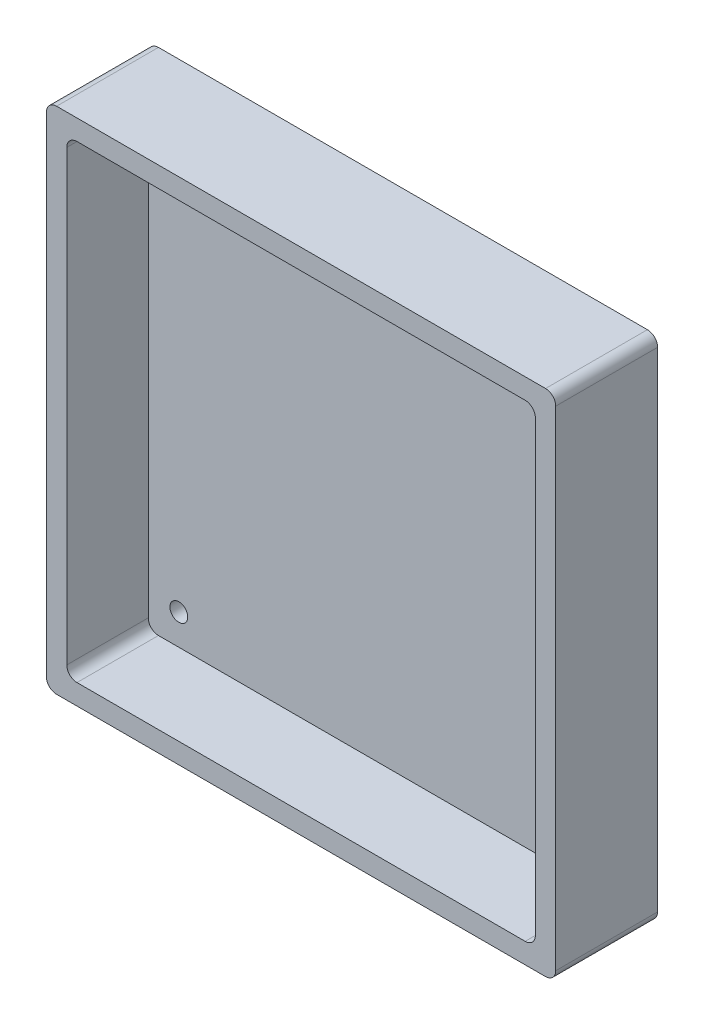
ISO-10303-21;
HEADER;
FILE_DESCRIPTION(('STEP AP214'),'2;1');
FILE_NAME('part.step','',(''),(''),'','','');
FILE_SCHEMA(('AUTOMOTIVE_DESIGN { 1 0 10303 214 1 1 1 1 }'));
ENDSEC;
DATA;
#1=APPLICATION_CONTEXT('core data for automotive mechanical design processes');
#2=APPLICATION_PROTOCOL_DEFINITION('international standard','automotive_design',2000,#1);
#3=PRODUCT_CONTEXT('',#1,'mechanical');
#4=PRODUCT('Part','Part','',(#3));
#5=PRODUCT_RELATED_PRODUCT_CATEGORY('part','',(#4));
#6=PRODUCT_DEFINITION_FORMATION('','',#4);
#7=PRODUCT_DEFINITION_CONTEXT('part definition',#1,'design');
#8=PRODUCT_DEFINITION('design','',#6,#7);
#9=PRODUCT_DEFINITION_SHAPE('','',#8);
#10=(LENGTH_UNIT() NAMED_UNIT(*) SI_UNIT(.MILLI.,.METRE.));
#11=(NAMED_UNIT(*) PLANE_ANGLE_UNIT() SI_UNIT($,.RADIAN.));
#12=(NAMED_UNIT(*) SI_UNIT($,.STERADIAN.) SOLID_ANGLE_UNIT());
#13=UNCERTAINTY_MEASURE_WITH_UNIT(LENGTH_MEASURE(1.E-05),#10,'distance_accuracy_value','');
#14=(GEOMETRIC_REPRESENTATION_CONTEXT(3) GLOBAL_UNCERTAINTY_ASSIGNED_CONTEXT((#13)) GLOBAL_UNIT_ASSIGNED_CONTEXT((#10,
#11,#12)) REPRESENTATION_CONTEXT('',''));
#15=CARTESIAN_POINT('',(0.,0.,0.));
#16=DIRECTION('',(0.,0.,1.));
#17=DIRECTION('',(1.,0.,0.));
#18=AXIS2_PLACEMENT_3D('',#15,#16,#17);
#19=CARTESIAN_POINT('',(-50.,50.,20.));
#20=DIRECTION('',(1.,0.,0.));
#21=DIRECTION('',(0.,1.,0.));
#22=AXIS2_PLACEMENT_3D('',#19,#20,#21);
#23=PLANE('',#22);
#24=DIRECTION('',(0.,-1.,0.));
#25=VECTOR('',#24,1.);
#26=CARTESIAN_POINT('',(-50.,50.,0.));
#27=LINE('',#26,#25);
#28=CARTESIAN_POINT('',(-50.,48.,0.));
#29=VERTEX_POINT('',#28);
#30=CARTESIAN_POINT('',(-50.,-48.,0.));
#31=VERTEX_POINT('',#30);
#32=EDGE_CURVE('E206',#29,#31,#27,.T.);
#33=ORIENTED_EDGE('',*,*,#32,.T.);
#34=DIRECTION('',(0.,0.,-1.));
#35=VECTOR('',#34,1.);
#36=CARTESIAN_POINT('',(-50.,-48.,20.));
#37=LINE('',#36,#35);
#38=CARTESIAN_POINT('',(-50.,-48.,20.));
#39=VERTEX_POINT('',#38);
#40=EDGE_CURVE('E266',#31,#39,#37,.F.);
#41=ORIENTED_EDGE('',*,*,#40,.T.);
#42=DIRECTION('',(0.,-1.,0.));
#43=VECTOR('',#42,1.);
#44=CARTESIAN_POINT('',(-50.,50.,20.));
#45=LINE('',#44,#43);
#46=CARTESIAN_POINT('',(-50.,48.,20.));
#47=VERTEX_POINT('',#46);
#48=EDGE_CURVE('E195',#47,#39,#45,.T.);
#49=ORIENTED_EDGE('',*,*,#48,.F.);
#50=DIRECTION('',(0.,0.,-1.));
#51=VECTOR('',#50,1.);
#52=CARTESIAN_POINT('',(-50.,48.,20.));
#53=LINE('',#52,#51);
#54=EDGE_CURVE('E263',#47,#29,#53,.T.);
#55=ORIENTED_EDGE('',*,*,#54,.T.);
#56=EDGE_LOOP('',(#33,#41,#49,#55));
#57=FACE_BOUND('',#56,.T.);
#58=ADVANCED_FACE('F39',(#57),#23,.F.);
#59=CARTESIAN_POINT('',(50.,-50.,20.));
#60=DIRECTION('',(0.,1.,0.));
#61=DIRECTION('',(-1.,0.,0.));
#62=AXIS2_PLACEMENT_3D('',#59,#60,#61);
#63=PLANE('',#62);
#64=DIRECTION('',(1.,0.,0.));
#65=VECTOR('',#64,1.);
#66=CARTESIAN_POINT('',(50.,-50.,0.));
#67=LINE('',#66,#65);
#68=CARTESIAN_POINT('',(-48.,-50.,0.));
#69=VERTEX_POINT('',#68);
#70=CARTESIAN_POINT('',(48.,-50.,0.));
#71=VERTEX_POINT('',#70);
#72=EDGE_CURVE('E209',#69,#71,#67,.T.);
#73=ORIENTED_EDGE('',*,*,#72,.T.);
#74=DIRECTION('',(0.,0.,-1.));
#75=VECTOR('',#74,1.);
#76=CARTESIAN_POINT('',(48.,-50.,20.));
#77=LINE('',#76,#75);
#78=CARTESIAN_POINT('',(48.,-50.,20.));
#79=VERTEX_POINT('',#78);
#80=EDGE_CURVE('E254',#71,#79,#77,.F.);
#81=ORIENTED_EDGE('',*,*,#80,.T.);
#82=DIRECTION('',(1.,0.,0.));
#83=VECTOR('',#82,1.);
#84=CARTESIAN_POINT('',(50.,-50.,20.));
#85=LINE('',#84,#83);
#86=CARTESIAN_POINT('',(-48.,-50.,20.));
#87=VERTEX_POINT('',#86);
#88=EDGE_CURVE('E198',#87,#79,#85,.T.);
#89=ORIENTED_EDGE('',*,*,#88,.F.);
#90=DIRECTION('',(0.,0.,-1.));
#91=VECTOR('',#90,1.);
#92=CARTESIAN_POINT('',(-48.,-50.,20.));
#93=LINE('',#92,#91);
#94=EDGE_CURVE('E251',#87,#69,#93,.T.);
#95=ORIENTED_EDGE('',*,*,#94,.T.);
#96=EDGE_LOOP('',(#73,#81,#89,#95));
#97=FACE_BOUND('',#96,.T.);
#98=ADVANCED_FACE('F349',(#97),#63,.F.);
#99=CARTESIAN_POINT('',(50.,50.,20.));
#100=DIRECTION('',(-1.,0.,0.));
#101=DIRECTION('',(0.,-1.,0.));
#102=AXIS2_PLACEMENT_3D('',#99,#100,#101);
#103=PLANE('',#102);
#104=DIRECTION('',(0.,1.,0.));
#105=VECTOR('',#104,1.);
#106=CARTESIAN_POINT('',(50.,50.,20.));
#107=LINE('',#106,#105);
#108=CARTESIAN_POINT('',(50.,-48.,20.));
#109=VERTEX_POINT('',#108);
#110=CARTESIAN_POINT('',(50.,48.,20.));
#111=VERTEX_POINT('',#110);
#112=EDGE_CURVE('E202',#109,#111,#107,.T.);
#113=ORIENTED_EDGE('',*,*,#112,.F.);
#114=DIRECTION('',(0.,0.,-1.));
#115=VECTOR('',#114,1.);
#116=CARTESIAN_POINT('',(50.,-48.,20.));
#117=LINE('',#116,#115);
#118=CARTESIAN_POINT('',(50.,-48.,0.));
#119=VERTEX_POINT('',#118);
#120=EDGE_CURVE('E240',#109,#119,#117,.T.);
#121=ORIENTED_EDGE('',*,*,#120,.T.);
#122=DIRECTION('',(0.,1.,0.));
#123=VECTOR('',#122,1.);
#124=CARTESIAN_POINT('',(50.,50.,0.));
#125=LINE('',#124,#123);
#126=CARTESIAN_POINT('',(50.,48.,0.));
#127=VERTEX_POINT('',#126);
#128=EDGE_CURVE('E212',#119,#127,#125,.T.);
#129=ORIENTED_EDGE('',*,*,#128,.T.);
#130=DIRECTION('',(0.,0.,-1.));
#131=VECTOR('',#130,1.);
#132=CARTESIAN_POINT('',(50.,48.,20.));
#133=LINE('',#132,#131);
#134=EDGE_CURVE('E238',#127,#111,#133,.F.);
#135=ORIENTED_EDGE('',*,*,#134,.T.);
#136=EDGE_LOOP('',(#113,#121,#129,#135));
#137=FACE_BOUND('',#136,.T.);
#138=ADVANCED_FACE('F355',(#137),#103,.F.);
#139=CARTESIAN_POINT('',(50.,50.,20.));
#140=DIRECTION('',(0.,-1.,0.));
#141=DIRECTION('',(1.,0.,0.));
#142=AXIS2_PLACEMENT_3D('',#139,#140,#141);
#143=PLANE('',#142);
#144=DIRECTION('',(-1.,0.,0.));
#145=VECTOR('',#144,1.);
#146=CARTESIAN_POINT('',(50.,50.,0.));
#147=LINE('',#146,#145);
#148=CARTESIAN_POINT('',(48.,50.,0.));
#149=VERTEX_POINT('',#148);
#150=CARTESIAN_POINT('',(-48.,50.,0.));
#151=VERTEX_POINT('',#150);
#152=EDGE_CURVE('E199',#149,#151,#147,.T.);
#153=ORIENTED_EDGE('',*,*,#152,.T.);
#154=DIRECTION('',(0.,0.,-1.));
#155=VECTOR('',#154,1.);
#156=CARTESIAN_POINT('',(-48.,50.,20.));
#157=LINE('',#156,#155);
#158=CARTESIAN_POINT('',(-48.,50.,20.));
#159=VERTEX_POINT('',#158);
#160=EDGE_CURVE('E56',#151,#159,#157,.F.);
#161=ORIENTED_EDGE('',*,*,#160,.T.);
#162=DIRECTION('',(-1.,0.,0.));
#163=VECTOR('',#162,1.);
#164=CARTESIAN_POINT('',(50.,50.,20.));
#165=LINE('',#164,#163);
#166=CARTESIAN_POINT('',(48.,50.,20.));
#167=VERTEX_POINT('',#166);
#168=EDGE_CURVE('E204',#167,#159,#165,.T.);
#169=ORIENTED_EDGE('',*,*,#168,.F.);
#170=DIRECTION('',(0.,0.,-1.));
#171=VECTOR('',#170,1.);
#172=CARTESIAN_POINT('',(48.,50.,20.));
#173=LINE('',#172,#171);
#174=EDGE_CURVE('E268',#167,#149,#173,.T.);
#175=ORIENTED_EDGE('',*,*,#174,.T.);
#176=EDGE_LOOP('',(#153,#161,#169,#175));
#177=FACE_BOUND('',#176,.T.);
#178=ADVANCED_FACE('F534',(#177),#143,.F.);
#179=CARTESIAN_POINT('',(0.,0.,20.));
#180=DIRECTION('',(0.,0.,-1.));
#181=DIRECTION('',(-1.,0.,0.));
#182=AXIS2_PLACEMENT_3D('',#179,#180,#181);
#183=PLANE('',#182);
#184=DIRECTION('',(1.,0.,0.));
#185=VECTOR('',#184,1.);
#186=CARTESIAN_POINT('',(46.,-46.,20.));
#187=LINE('',#186,#185);
#188=CARTESIAN_POINT('',(-44.,-46.,20.));
#189=VERTEX_POINT('',#188);
#190=CARTESIAN_POINT('',(44.,-46.,20.));
#191=VERTEX_POINT('',#190);
#192=EDGE_CURVE('E180',#189,#191,#187,.T.);
#193=ORIENTED_EDGE('',*,*,#192,.F.);
#194=CARTESIAN_POINT('',(-44.,-44.,20.));
#195=DIRECTION('',(0.,0.,-1.));
#196=DIRECTION('',(-1.,0.,0.));
#197=AXIS2_PLACEMENT_3D('',#194,#195,#196);
#198=CIRCLE('',#197,2.);
#199=CARTESIAN_POINT('',(-46.,-44.,20.));
#200=VERTEX_POINT('',#199);
#201=EDGE_CURVE('E11',#189,#200,#198,.T.);
#202=ORIENTED_EDGE('',*,*,#201,.T.);
#203=DIRECTION('',(0.,-1.,0.));
#204=VECTOR('',#203,1.);
#205=CARTESIAN_POINT('',(-46.,-46.,20.));
#206=LINE('',#205,#204);
#207=CARTESIAN_POINT('',(-46.,44.,20.));
#208=VERTEX_POINT('',#207);
#209=EDGE_CURVE('E171',#208,#200,#206,.T.);
#210=ORIENTED_EDGE('',*,*,#209,.F.);
#211=CARTESIAN_POINT('',(-44.,44.,20.));
#212=DIRECTION('',(0.,0.,-1.));
#213=DIRECTION('',(-1.,0.,0.));
#214=AXIS2_PLACEMENT_3D('',#211,#212,#213);
#215=CIRCLE('',#214,2.);
#216=CARTESIAN_POINT('',(-44.,46.,20.));
#217=VERTEX_POINT('',#216);
#218=EDGE_CURVE('E155',#208,#217,#215,.T.);
#219=ORIENTED_EDGE('',*,*,#218,.T.);
#220=DIRECTION('',(-1.,0.,0.));
#221=VECTOR('',#220,1.);
#222=CARTESIAN_POINT('',(46.,46.,20.));
#223=LINE('',#222,#221);
#224=CARTESIAN_POINT('',(44.,46.,20.));
#225=VERTEX_POINT('',#224);
#226=EDGE_CURVE('E193',#225,#217,#223,.T.);
#227=ORIENTED_EDGE('',*,*,#226,.F.);
#228=CARTESIAN_POINT('',(44.,44.,20.));
#229=DIRECTION('',(0.,0.,-1.));
#230=DIRECTION('',(-1.,0.,0.));
#231=AXIS2_PLACEMENT_3D('',#228,#229,#230);
#232=CIRCLE('',#231,2.);
#233=CARTESIAN_POINT('',(46.,44.,20.));
#234=VERTEX_POINT('',#233);
#235=EDGE_CURVE('E165',#225,#234,#232,.T.);
#236=ORIENTED_EDGE('',*,*,#235,.T.);
#237=DIRECTION('',(0.,1.,0.));
#238=VECTOR('',#237,1.);
#239=CARTESIAN_POINT('',(46.,-46.,20.));
#240=LINE('',#239,#238);
#241=CARTESIAN_POINT('',(46.,-44.,20.));
#242=VERTEX_POINT('',#241);
#243=EDGE_CURVE('E183',#242,#234,#240,.T.);
#244=ORIENTED_EDGE('',*,*,#243,.F.);
#245=CARTESIAN_POINT('',(44.,-44.,20.));
#246=DIRECTION('',(0.,0.,-1.));
#247=DIRECTION('',(-1.,0.,0.));
#248=AXIS2_PLACEMENT_3D('',#245,#246,#247);
#249=CIRCLE('',#248,2.);
#250=EDGE_CURVE('E48',#242,#191,#249,.T.);
#251=ORIENTED_EDGE('',*,*,#250,.T.);
#252=EDGE_LOOP('',(#193,#202,#210,#219,#227,#236,#244,#251));
#253=FACE_BOUND('',#252,.T.);
#254=ORIENTED_EDGE('',*,*,#88,.T.);
#255=CARTESIAN_POINT('',(48.,-48.,20.));
#256=DIRECTION('',(0.,0.,-1.));
#257=DIRECTION('',(-1.,0.,0.));
#258=AXIS2_PLACEMENT_3D('',#255,#256,#257);
#259=CIRCLE('',#258,2.);
#260=EDGE_CURVE('E261',#79,#109,#259,.F.);
#261=ORIENTED_EDGE('',*,*,#260,.T.);
#262=ORIENTED_EDGE('',*,*,#112,.T.);
#263=CARTESIAN_POINT('',(48.,48.,20.));
#264=DIRECTION('',(0.,0.,-1.));
#265=DIRECTION('',(-1.,0.,0.));
#266=AXIS2_PLACEMENT_3D('',#263,#264,#265);
#267=CIRCLE('',#266,2.);
#268=EDGE_CURVE('E63',#111,#167,#267,.F.);
#269=ORIENTED_EDGE('',*,*,#268,.T.);
#270=ORIENTED_EDGE('',*,*,#168,.T.);
#271=CARTESIAN_POINT('',(-48.,48.,20.));
#272=DIRECTION('',(0.,0.,-1.));
#273=DIRECTION('',(-1.,0.,0.));
#274=AXIS2_PLACEMENT_3D('',#271,#272,#273);
#275=CIRCLE('',#274,2.);
#276=EDGE_CURVE('E257',#159,#47,#275,.F.);
#277=ORIENTED_EDGE('',*,*,#276,.T.);
#278=ORIENTED_EDGE('',*,*,#48,.T.);
#279=CARTESIAN_POINT('',(-48.,-48.,20.));
#280=DIRECTION('',(0.,0.,-1.));
#281=DIRECTION('',(-1.,0.,0.));
#282=AXIS2_PLACEMENT_3D('',#279,#280,#281);
#283=CIRCLE('',#282,2.);
#284=EDGE_CURVE('E259',#39,#87,#283,.F.);
#285=ORIENTED_EDGE('',*,*,#284,.T.);
#286=EDGE_LOOP('',(#254,#261,#262,#269,#270,#277,#278,#285));
#287=FACE_BOUND('',#286,.T.);
#288=ADVANCED_FACE('F179',(#253,#287),#183,.F.);
#289=CARTESIAN_POINT('',(0.,0.,0.));
#290=DIRECTION('',(0.,0.,-1.));
#291=DIRECTION('',(-1.,0.,0.));
#292=AXIS2_PLACEMENT_3D('',#289,#290,#291);
#293=PLANE('',#292);
#294=CARTESIAN_POINT('',(-39.9999999999977,-40.,0.));
#295=DIRECTION('',(0.,0.,1.));
#296=DIRECTION('',(1.,0.,0.));
#297=AXIS2_PLACEMENT_3D('',#294,#295,#296);
#298=CIRCLE('',#297,1.75);
#299=CARTESIAN_POINT('',(-38.2499999999977,-40.,0.));
#300=VERTEX_POINT('',#299);
#301=EDGE_CURVE('E297',#300,#300,#298,.T.);
#302=ORIENTED_EDGE('',*,*,#301,.T.);
#303=EDGE_LOOP('',(#302));
#304=FACE_BOUND('',#303,.T.);
#305=CARTESIAN_POINT('',(40.0000000000023,-39.9999999999978,0.));
#306=DIRECTION('',(0.,0.,1.));
#307=DIRECTION('',(1.,0.,0.));
#308=AXIS2_PLACEMENT_3D('',#305,#306,#307);
#309=CIRCLE('',#308,1.75);
#310=CARTESIAN_POINT('',(41.7500000000023,-39.9999999999978,0.));
#311=VERTEX_POINT('',#310);
#312=EDGE_CURVE('E294',#311,#311,#309,.T.);
#313=ORIENTED_EDGE('',*,*,#312,.T.);
#314=EDGE_LOOP('',(#313));
#315=FACE_BOUND('',#314,.T.);
#316=CARTESIAN_POINT('',(40.,40.0000000000023,0.));
#317=DIRECTION('',(0.,0.,1.));
#318=DIRECTION('',(1.,0.,0.));
#319=AXIS2_PLACEMENT_3D('',#316,#317,#318);
#320=CIRCLE('',#319,1.75);
#321=CARTESIAN_POINT('',(41.75,40.0000000000023,0.));
#322=VERTEX_POINT('',#321);
#323=EDGE_CURVE('E296',#322,#322,#320,.T.);
#324=ORIENTED_EDGE('',*,*,#323,.T.);
#325=EDGE_LOOP('',(#324));
#326=FACE_BOUND('',#325,.T.);
#327=CARTESIAN_POINT('',(-40.,40.,0.));
#328=DIRECTION('',(0.,0.,1.));
#329=DIRECTION('',(1.,0.,0.));
#330=AXIS2_PLACEMENT_3D('',#327,#328,#329);
#331=CIRCLE('',#330,1.75);
#332=CARTESIAN_POINT('',(-38.25,40.,0.));
#333=VERTEX_POINT('',#332);
#334=EDGE_CURVE('E278',#333,#333,#331,.T.);
#335=ORIENTED_EDGE('',*,*,#334,.T.);
#336=EDGE_LOOP('',(#335));
#337=FACE_BOUND('',#336,.T.);
#338=ORIENTED_EDGE('',*,*,#128,.F.);
#339=CARTESIAN_POINT('',(48.,-48.,0.));
#340=DIRECTION('',(0.,0.,-1.));
#341=DIRECTION('',(-1.,0.,0.));
#342=AXIS2_PLACEMENT_3D('',#339,#340,#341);
#343=CIRCLE('',#342,2.);
#344=EDGE_CURVE('E249',#119,#71,#343,.T.);
#345=ORIENTED_EDGE('',*,*,#344,.T.);
#346=ORIENTED_EDGE('',*,*,#72,.F.);
#347=CARTESIAN_POINT('',(-48.,-48.,0.));
#348=DIRECTION('',(0.,0.,-1.));
#349=DIRECTION('',(-1.,0.,0.));
#350=AXIS2_PLACEMENT_3D('',#347,#348,#349);
#351=CIRCLE('',#350,2.);
#352=EDGE_CURVE('E247',#69,#31,#351,.T.);
#353=ORIENTED_EDGE('',*,*,#352,.T.);
#354=ORIENTED_EDGE('',*,*,#32,.F.);
#355=CARTESIAN_POINT('',(-48.,48.,0.));
#356=DIRECTION('',(0.,0.,-1.));
#357=DIRECTION('',(-1.,0.,0.));
#358=AXIS2_PLACEMENT_3D('',#355,#356,#357);
#359=CIRCLE('',#358,2.);
#360=EDGE_CURVE('E245',#29,#151,#359,.T.);
#361=ORIENTED_EDGE('',*,*,#360,.T.);
#362=ORIENTED_EDGE('',*,*,#152,.F.);
#363=CARTESIAN_POINT('',(48.,48.,0.));
#364=DIRECTION('',(0.,0.,-1.));
#365=DIRECTION('',(-1.,0.,0.));
#366=AXIS2_PLACEMENT_3D('',#363,#364,#365);
#367=CIRCLE('',#366,2.);
#368=EDGE_CURVE('E243',#149,#127,#367,.T.);
#369=ORIENTED_EDGE('',*,*,#368,.T.);
#370=EDGE_LOOP('',(#338,#345,#346,#353,#354,#361,#362,#369));
#371=FACE_BOUND('',#370,.T.);
#372=ADVANCED_FACE('F422',(#304,#315,#326,#337,#371),#293,.T.);
#373=CARTESIAN_POINT('',(-46.,-46.,4.));
#374=DIRECTION('',(-1.,0.,0.));
#375=DIRECTION('',(0.,0.,1.));
#376=AXIS2_PLACEMENT_3D('',#373,#374,#375);
#377=PLANE('',#376);
#378=DIRECTION('',(0.,-1.,0.));
#379=VECTOR('',#378,1.);
#380=CARTESIAN_POINT('',(-46.,-46.,4.));
#381=LINE('',#380,#379);
#382=CARTESIAN_POINT('',(-46.,44.,4.));
#383=VERTEX_POINT('',#382);
#384=CARTESIAN_POINT('',(-46.,-44.,4.));
#385=VERTEX_POINT('',#384);
#386=EDGE_CURVE('E174',#383,#385,#381,.T.);
#387=ORIENTED_EDGE('',*,*,#386,.F.);
#388=DIRECTION('',(0.,0.,1.));
#389=VECTOR('',#388,1.);
#390=CARTESIAN_POINT('',(-46.,44.,20.));
#391=LINE('',#390,#389);
#392=EDGE_CURVE('E159',#383,#208,#391,.T.);
#393=ORIENTED_EDGE('',*,*,#392,.T.);
#394=ORIENTED_EDGE('',*,*,#209,.T.);
#395=DIRECTION('',(0.,0.,1.));
#396=VECTOR('',#395,1.);
#397=CARTESIAN_POINT('',(-46.,-44.,4.));
#398=LINE('',#397,#396);
#399=EDGE_CURVE('E176',#200,#385,#398,.F.);
#400=ORIENTED_EDGE('',*,*,#399,.T.);
#401=EDGE_LOOP('',(#387,#393,#394,#400));
#402=FACE_BOUND('',#401,.T.);
#403=ADVANCED_FACE('F170',(#402),#377,.F.);
#404=CARTESIAN_POINT('',(46.,46.,4.));
#405=DIRECTION('',(0.,1.,0.));
#406=DIRECTION('',(-1.,0.,0.));
#407=AXIS2_PLACEMENT_3D('',#404,#405,#406);
#408=PLANE('',#407);
#409=ORIENTED_EDGE('',*,*,#226,.T.);
#410=DIRECTION('',(0.,0.,1.));
#411=VECTOR('',#410,1.);
#412=CARTESIAN_POINT('',(-44.,46.,4.));
#413=LINE('',#412,#411);
#414=CARTESIAN_POINT('',(-44.,46.,4.));
#415=VERTEX_POINT('',#414);
#416=EDGE_CURVE('E160',#217,#415,#413,.F.);
#417=ORIENTED_EDGE('',*,*,#416,.T.);
#418=DIRECTION('',(-1.,0.,0.));
#419=VECTOR('',#418,1.);
#420=CARTESIAN_POINT('',(46.,46.,4.));
#421=LINE('',#420,#419);
#422=CARTESIAN_POINT('',(44.,46.,4.));
#423=VERTEX_POINT('',#422);
#424=EDGE_CURVE('E188',#423,#415,#421,.T.);
#425=ORIENTED_EDGE('',*,*,#424,.F.);
#426=DIRECTION('',(0.,0.,1.));
#427=VECTOR('',#426,1.);
#428=CARTESIAN_POINT('',(44.,46.,20.));
#429=LINE('',#428,#427);
#430=EDGE_CURVE('E175',#423,#225,#429,.T.);
#431=ORIENTED_EDGE('',*,*,#430,.T.);
#432=EDGE_LOOP('',(#409,#417,#425,#431));
#433=FACE_BOUND('',#432,.T.);
#434=ADVANCED_FACE('F318',(#433),#408,.F.);
#435=CARTESIAN_POINT('',(46.,-46.,4.));
#436=DIRECTION('',(1.,0.,0.));
#437=DIRECTION('',(0.,0.,-1.));
#438=AXIS2_PLACEMENT_3D('',#435,#436,#437);
#439=PLANE('',#438);
#440=ORIENTED_EDGE('',*,*,#243,.T.);
#441=DIRECTION('',(0.,0.,1.));
#442=VECTOR('',#441,1.);
#443=CARTESIAN_POINT('',(46.,44.,4.));
#444=LINE('',#443,#442);
#445=CARTESIAN_POINT('',(46.,44.,4.));
#446=VERTEX_POINT('',#445);
#447=EDGE_CURVE('E231',#234,#446,#444,.F.);
#448=ORIENTED_EDGE('',*,*,#447,.T.);
#449=DIRECTION('',(0.,1.,0.));
#450=VECTOR('',#449,1.);
#451=CARTESIAN_POINT('',(46.,-46.,4.));
#452=LINE('',#451,#450);
#453=CARTESIAN_POINT('',(46.,-44.,4.));
#454=VERTEX_POINT('',#453);
#455=EDGE_CURVE('E309',#454,#446,#452,.T.);
#456=ORIENTED_EDGE('',*,*,#455,.F.);
#457=DIRECTION('',(0.,0.,1.));
#458=VECTOR('',#457,1.);
#459=CARTESIAN_POINT('',(46.,-44.,20.));
#460=LINE('',#459,#458);
#461=EDGE_CURVE('E228',#454,#242,#460,.T.);
#462=ORIENTED_EDGE('',*,*,#461,.T.);
#463=EDGE_LOOP('',(#440,#448,#456,#462));
#464=FACE_BOUND('',#463,.T.);
#465=ADVANCED_FACE('F324',(#464),#439,.F.);
#466=CARTESIAN_POINT('',(46.,-46.,4.));
#467=DIRECTION('',(0.,-1.,0.));
#468=DIRECTION('',(1.,0.,0.));
#469=AXIS2_PLACEMENT_3D('',#466,#467,#468);
#470=PLANE('',#469);
#471=ORIENTED_EDGE('',*,*,#192,.T.);
#472=DIRECTION('',(0.,0.,1.));
#473=VECTOR('',#472,1.);
#474=CARTESIAN_POINT('',(44.,-46.,4.));
#475=LINE('',#474,#473);
#476=CARTESIAN_POINT('',(44.,-46.,4.));
#477=VERTEX_POINT('',#476);
#478=EDGE_CURVE('E236',#191,#477,#475,.F.);
#479=ORIENTED_EDGE('',*,*,#478,.T.);
#480=DIRECTION('',(1.,0.,0.));
#481=VECTOR('',#480,1.);
#482=CARTESIAN_POINT('',(46.,-46.,4.));
#483=LINE('',#482,#481);
#484=CARTESIAN_POINT('',(-44.,-46.,4.));
#485=VERTEX_POINT('',#484);
#486=EDGE_CURVE('E307',#485,#477,#483,.T.);
#487=ORIENTED_EDGE('',*,*,#486,.F.);
#488=DIRECTION('',(0.,0.,1.));
#489=VECTOR('',#488,1.);
#490=CARTESIAN_POINT('',(-44.,-46.,20.));
#491=LINE('',#490,#489);
#492=EDGE_CURVE('E233',#485,#189,#491,.T.);
#493=ORIENTED_EDGE('',*,*,#492,.T.);
#494=EDGE_LOOP('',(#471,#479,#487,#493));
#495=FACE_BOUND('',#494,.T.);
#496=ADVANCED_FACE('F331',(#495),#470,.F.);
#497=CARTESIAN_POINT('',(0.,0.,4.));
#498=DIRECTION('',(0.,0.,1.));
#499=DIRECTION('',(1.,0.,0.));
#500=AXIS2_PLACEMENT_3D('',#497,#498,#499);
#501=PLANE('',#500);
#502=CARTESIAN_POINT('',(-39.9999999999977,-40.,4.));
#503=DIRECTION('',(0.,0.,1.));
#504=DIRECTION('',(1.,0.,0.));
#505=AXIS2_PLACEMENT_3D('',#502,#503,#504);
#506=CIRCLE('',#505,1.75);
#507=CARTESIAN_POINT('',(-38.2499999999977,-40.,4.));
#508=VERTEX_POINT('',#507);
#509=EDGE_CURVE('E43',#508,#508,#506,.F.);
#510=ORIENTED_EDGE('',*,*,#509,.T.);
#511=EDGE_LOOP('',(#510));
#512=FACE_BOUND('',#511,.T.);
#513=CARTESIAN_POINT('',(40.0000000000023,-39.9999999999978,4.));
#514=DIRECTION('',(0.,0.,1.));
#515=DIRECTION('',(1.,0.,0.));
#516=AXIS2_PLACEMENT_3D('',#513,#514,#515);
#517=CIRCLE('',#516,1.75);
#518=CARTESIAN_POINT('',(41.7500000000023,-39.9999999999978,4.));
#519=VERTEX_POINT('',#518);
#520=EDGE_CURVE('E186',#519,#519,#517,.F.);
#521=ORIENTED_EDGE('',*,*,#520,.T.);
#522=EDGE_LOOP('',(#521));
#523=FACE_BOUND('',#522,.T.);
#524=CARTESIAN_POINT('',(40.,40.0000000000023,4.));
#525=DIRECTION('',(0.,0.,1.));
#526=DIRECTION('',(1.,0.,0.));
#527=AXIS2_PLACEMENT_3D('',#524,#525,#526);
#528=CIRCLE('',#527,1.75);
#529=CARTESIAN_POINT('',(41.75,40.0000000000023,4.));
#530=VERTEX_POINT('',#529);
#531=EDGE_CURVE('E277',#530,#530,#528,.F.);
#532=ORIENTED_EDGE('',*,*,#531,.T.);
#533=EDGE_LOOP('',(#532));
#534=FACE_BOUND('',#533,.T.);
#535=CARTESIAN_POINT('',(-40.,40.,4.));
#536=DIRECTION('',(0.,0.,1.));
#537=DIRECTION('',(1.,0.,0.));
#538=AXIS2_PLACEMENT_3D('',#535,#536,#537);
#539=CIRCLE('',#538,1.75);
#540=CARTESIAN_POINT('',(-38.25,40.,4.));
#541=VERTEX_POINT('',#540);
#542=EDGE_CURVE('E274',#541,#541,#539,.F.);
#543=ORIENTED_EDGE('',*,*,#542,.T.);
#544=EDGE_LOOP('',(#543));
#545=FACE_BOUND('',#544,.T.);
#546=ORIENTED_EDGE('',*,*,#424,.T.);
#547=CARTESIAN_POINT('',(-44.,44.,4.));
#548=DIRECTION('',(0.,0.,1.));
#549=DIRECTION('',(1.,0.,0.));
#550=AXIS2_PLACEMENT_3D('',#547,#548,#549);
#551=CIRCLE('',#550,2.);
#552=EDGE_CURVE('E226',#415,#383,#551,.T.);
#553=ORIENTED_EDGE('',*,*,#552,.T.);
#554=ORIENTED_EDGE('',*,*,#386,.T.);
#555=CARTESIAN_POINT('',(-44.,-44.,4.));
#556=DIRECTION('',(0.,0.,1.));
#557=DIRECTION('',(1.,0.,0.));
#558=AXIS2_PLACEMENT_3D('',#555,#556,#557);
#559=CIRCLE('',#558,2.);
#560=EDGE_CURVE('E220',#385,#485,#559,.T.);
#561=ORIENTED_EDGE('',*,*,#560,.T.);
#562=ORIENTED_EDGE('',*,*,#486,.T.);
#563=CARTESIAN_POINT('',(44.,-44.,4.));
#564=DIRECTION('',(0.,0.,1.));
#565=DIRECTION('',(1.,0.,0.));
#566=AXIS2_PLACEMENT_3D('',#563,#564,#565);
#567=CIRCLE('',#566,2.);
#568=EDGE_CURVE('E222',#477,#454,#567,.T.);
#569=ORIENTED_EDGE('',*,*,#568,.T.);
#570=ORIENTED_EDGE('',*,*,#455,.T.);
#571=CARTESIAN_POINT('',(44.,44.,4.));
#572=DIRECTION('',(0.,0.,1.));
#573=DIRECTION('',(1.,0.,0.));
#574=AXIS2_PLACEMENT_3D('',#571,#572,#573);
#575=CIRCLE('',#574,2.);
#576=EDGE_CURVE('E224',#446,#423,#575,.T.);
#577=ORIENTED_EDGE('',*,*,#576,.T.);
#578=EDGE_LOOP('',(#546,#553,#554,#561,#562,#569,#570,#577));
#579=FACE_BOUND('',#578,.T.);
#580=ADVANCED_FACE('F283',(#512,#523,#534,#545,#579),#501,.T.);
#581=CARTESIAN_POINT('',(-44.,44.,4.));
#582=DIRECTION('',(0.,0.,-1.));
#583=DIRECTION('',(-1.,0.,0.));
#584=AXIS2_PLACEMENT_3D('',#581,#582,#583);
#585=CYLINDRICAL_SURFACE('',#584,2.);
#586=ORIENTED_EDGE('',*,*,#552,.F.);
#587=ORIENTED_EDGE('',*,*,#416,.F.);
#588=ORIENTED_EDGE('',*,*,#218,.F.);
#589=ORIENTED_EDGE('',*,*,#392,.F.);
#590=EDGE_LOOP('',(#586,#587,#588,#589));
#591=FACE_BOUND('',#590,.T.);
#592=ADVANCED_FACE('F158',(#591),#585,.F.);
#593=CARTESIAN_POINT('',(44.,44.,4.));
#594=DIRECTION('',(0.,0.,-1.));
#595=DIRECTION('',(-1.,0.,0.));
#596=AXIS2_PLACEMENT_3D('',#593,#594,#595);
#597=CYLINDRICAL_SURFACE('',#596,2.);
#598=ORIENTED_EDGE('',*,*,#576,.F.);
#599=ORIENTED_EDGE('',*,*,#447,.F.);
#600=ORIENTED_EDGE('',*,*,#235,.F.);
#601=ORIENTED_EDGE('',*,*,#430,.F.);
#602=EDGE_LOOP('',(#598,#599,#600,#601));
#603=FACE_BOUND('',#602,.T.);
#604=ADVANCED_FACE('F320',(#603),#597,.F.);
#605=CARTESIAN_POINT('',(44.,-44.,4.));
#606=DIRECTION('',(0.,0.,-1.));
#607=DIRECTION('',(-1.,0.,0.));
#608=AXIS2_PLACEMENT_3D('',#605,#606,#607);
#609=CYLINDRICAL_SURFACE('',#608,2.);
#610=ORIENTED_EDGE('',*,*,#568,.F.);
#611=ORIENTED_EDGE('',*,*,#478,.F.);
#612=ORIENTED_EDGE('',*,*,#250,.F.);
#613=ORIENTED_EDGE('',*,*,#461,.F.);
#614=EDGE_LOOP('',(#610,#611,#612,#613));
#615=FACE_BOUND('',#614,.T.);
#616=ADVANCED_FACE('F328',(#615),#609,.F.);
#617=CARTESIAN_POINT('',(-44.,-44.,4.));
#618=DIRECTION('',(0.,0.,-1.));
#619=DIRECTION('',(-1.,0.,0.));
#620=AXIS2_PLACEMENT_3D('',#617,#618,#619);
#621=CYLINDRICAL_SURFACE('',#620,2.);
#622=ORIENTED_EDGE('',*,*,#560,.F.);
#623=ORIENTED_EDGE('',*,*,#399,.F.);
#624=ORIENTED_EDGE('',*,*,#201,.F.);
#625=ORIENTED_EDGE('',*,*,#492,.F.);
#626=EDGE_LOOP('',(#622,#623,#624,#625));
#627=FACE_BOUND('',#626,.T.);
#628=ADVANCED_FACE('F336',(#627),#621,.F.);
#629=CARTESIAN_POINT('',(48.,-48.,20.));
#630=DIRECTION('',(0.,0.,-1.));
#631=DIRECTION('',(-1.,0.,0.));
#632=AXIS2_PLACEMENT_3D('',#629,#630,#631);
#633=CYLINDRICAL_SURFACE('',#632,2.);
#634=ORIENTED_EDGE('',*,*,#260,.F.);
#635=ORIENTED_EDGE('',*,*,#80,.F.);
#636=ORIENTED_EDGE('',*,*,#344,.F.);
#637=ORIENTED_EDGE('',*,*,#120,.F.);
#638=EDGE_LOOP('',(#634,#635,#636,#637));
#639=FACE_BOUND('',#638,.T.);
#640=ADVANCED_FACE('F338',(#639),#633,.T.);
#641=CARTESIAN_POINT('',(-48.,-48.,20.));
#642=DIRECTION('',(0.,0.,-1.));
#643=DIRECTION('',(-1.,0.,0.));
#644=AXIS2_PLACEMENT_3D('',#641,#642,#643);
#645=CYLINDRICAL_SURFACE('',#644,2.);
#646=ORIENTED_EDGE('',*,*,#284,.F.);
#647=ORIENTED_EDGE('',*,*,#40,.F.);
#648=ORIENTED_EDGE('',*,*,#352,.F.);
#649=ORIENTED_EDGE('',*,*,#94,.F.);
#650=EDGE_LOOP('',(#646,#647,#648,#649));
#651=FACE_BOUND('',#650,.T.);
#652=ADVANCED_FACE('F344',(#651),#645,.T.);
#653=CARTESIAN_POINT('',(-48.,48.,20.));
#654=DIRECTION('',(0.,0.,-1.));
#655=DIRECTION('',(-1.,0.,0.));
#656=AXIS2_PLACEMENT_3D('',#653,#654,#655);
#657=CYLINDRICAL_SURFACE('',#656,2.);
#658=ORIENTED_EDGE('',*,*,#276,.F.);
#659=ORIENTED_EDGE('',*,*,#160,.F.);
#660=ORIENTED_EDGE('',*,*,#360,.F.);
#661=ORIENTED_EDGE('',*,*,#54,.F.);
#662=EDGE_LOOP('',(#658,#659,#660,#661));
#663=FACE_BOUND('',#662,.T.);
#664=ADVANCED_FACE('F394',(#663),#657,.T.);
#665=CARTESIAN_POINT('',(48.,48.,20.));
#666=DIRECTION('',(0.,0.,-1.));
#667=DIRECTION('',(-1.,0.,0.));
#668=AXIS2_PLACEMENT_3D('',#665,#666,#667);
#669=CYLINDRICAL_SURFACE('',#668,2.);
#670=ORIENTED_EDGE('',*,*,#268,.F.);
#671=ORIENTED_EDGE('',*,*,#134,.F.);
#672=ORIENTED_EDGE('',*,*,#368,.F.);
#673=ORIENTED_EDGE('',*,*,#174,.F.);
#674=EDGE_LOOP('',(#670,#671,#672,#673));
#675=FACE_BOUND('',#674,.T.);
#676=ADVANCED_FACE('F41',(#675),#669,.T.);
#677=CARTESIAN_POINT('',(-40.,40.,16.));
#678=DIRECTION('',(0.,0.,-1.));
#679=DIRECTION('',(-1.,0.,0.));
#680=AXIS2_PLACEMENT_3D('',#677,#678,#679);
#681=CYLINDRICAL_SURFACE('',#680,1.75);
#682=ORIENTED_EDGE('',*,*,#542,.F.);
#683=EDGE_LOOP('',(#682));
#684=FACE_BOUND('',#683,.T.);
#685=ORIENTED_EDGE('',*,*,#334,.F.);
#686=EDGE_LOOP('',(#685));
#687=FACE_BOUND('',#686,.T.);
#688=ADVANCED_FACE('F414',(#684,#687),#681,.F.);
#689=CARTESIAN_POINT('',(40.,40.0000000000023,16.));
#690=DIRECTION('',(0.,0.,-1.));
#691=DIRECTION('',(-1.,0.,0.));
#692=AXIS2_PLACEMENT_3D('',#689,#690,#691);
#693=CYLINDRICAL_SURFACE('',#692,1.75);
#694=ORIENTED_EDGE('',*,*,#531,.F.);
#695=EDGE_LOOP('',(#694));
#696=FACE_BOUND('',#695,.T.);
#697=ORIENTED_EDGE('',*,*,#323,.F.);
#698=EDGE_LOOP('',(#697));
#699=FACE_BOUND('',#698,.T.);
#700=ADVANCED_FACE('F290',(#696,#699),#693,.F.);
#701=CARTESIAN_POINT('',(40.0000000000023,-39.9999999999978,16.));
#702=DIRECTION('',(0.,0.,-1.));
#703=DIRECTION('',(-1.,0.,0.));
#704=AXIS2_PLACEMENT_3D('',#701,#702,#703);
#705=CYLINDRICAL_SURFACE('',#704,1.75);
#706=ORIENTED_EDGE('',*,*,#520,.F.);
#707=EDGE_LOOP('',(#706));
#708=FACE_BOUND('',#707,.T.);
#709=ORIENTED_EDGE('',*,*,#312,.F.);
#710=EDGE_LOOP('',(#709));
#711=FACE_BOUND('',#710,.T.);
#712=ADVANCED_FACE('F286',(#708,#711),#705,.F.);
#713=CARTESIAN_POINT('',(-39.9999999999977,-40.,16.));
#714=DIRECTION('',(0.,0.,-1.));
#715=DIRECTION('',(-1.,0.,0.));
#716=AXIS2_PLACEMENT_3D('',#713,#714,#715);
#717=CYLINDRICAL_SURFACE('',#716,1.75);
#718=ORIENTED_EDGE('',*,*,#509,.F.);
#719=EDGE_LOOP('',(#718));
#720=FACE_BOUND('',#719,.T.);
#721=ORIENTED_EDGE('',*,*,#301,.F.);
#722=EDGE_LOOP('',(#721));
#723=FACE_BOUND('',#722,.T.);
#724=ADVANCED_FACE('F289',(#720,#723),#717,.F.);
#725=CLOSED_SHELL('',(#58,#98,#138,#178,#288,#372,#403,#434,#465,#496,#580,#592,#604,#616,#628,
#640,#652,#664,#676,#688,#700,#712,#724));
#726=MANIFOLD_SOLID_BREP('B2',#725);
#727=ADVANCED_BREP_SHAPE_REPRESENTATION('',(#18,#726),#14);
#728=SHAPE_DEFINITION_REPRESENTATION(#9,#727);
ENDSEC;
END-ISO-10303-21;
